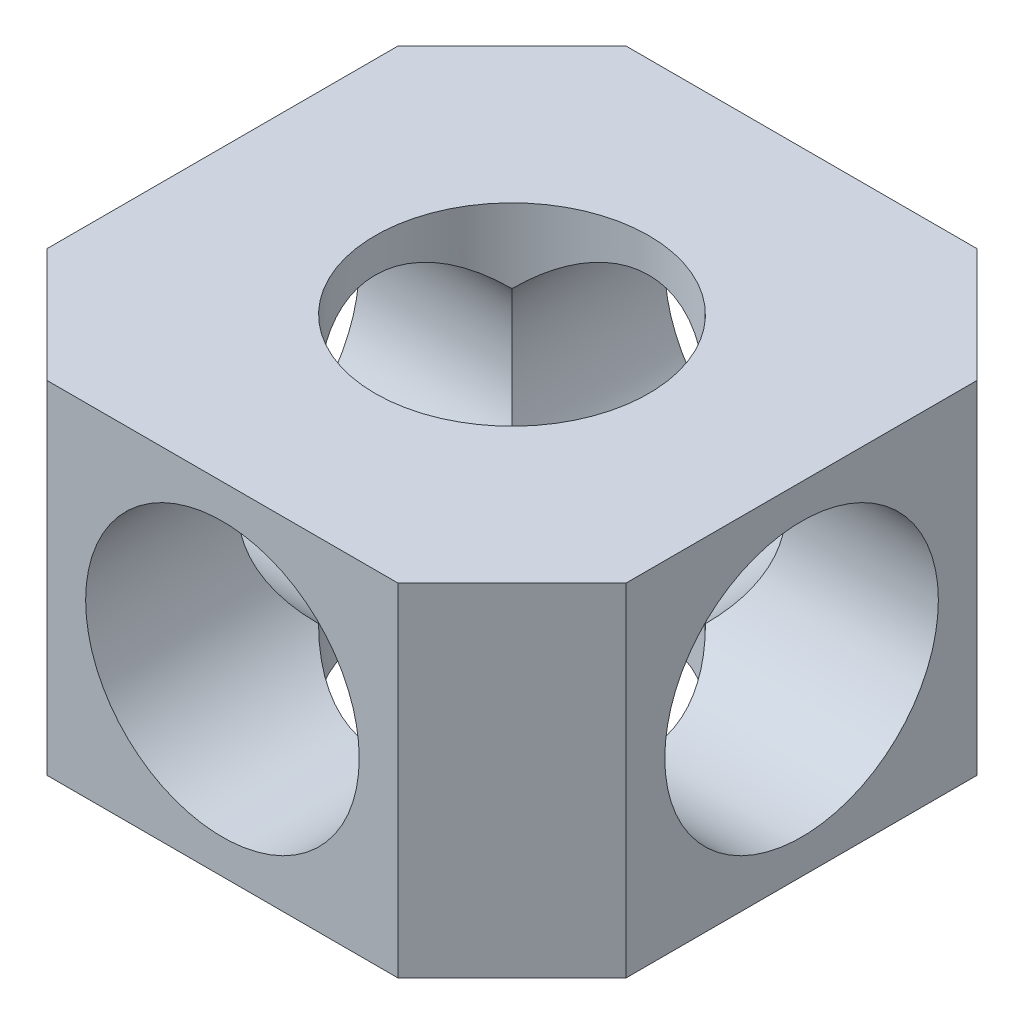
ISO-10303-21;
HEADER;
FILE_DESCRIPTION(('STEP AP214'),'2;1');
FILE_NAME('part.step','',(''),(''),'','','');
FILE_SCHEMA(('AUTOMOTIVE_DESIGN { 1 0 10303 214 1 1 1 1 }'));
ENDSEC;
DATA;
#1=APPLICATION_CONTEXT('core data for automotive mechanical design processes');
#2=APPLICATION_PROTOCOL_DEFINITION('international standard','automotive_design',2000,#1);
#3=PRODUCT_CONTEXT('',#1,'mechanical');
#4=PRODUCT('Part','Part','',(#3));
#5=PRODUCT_RELATED_PRODUCT_CATEGORY('part','',(#4));
#6=PRODUCT_DEFINITION_FORMATION('','',#4);
#7=PRODUCT_DEFINITION_CONTEXT('part definition',#1,'design');
#8=PRODUCT_DEFINITION('design','',#6,#7);
#9=PRODUCT_DEFINITION_SHAPE('','',#8);
#10=(LENGTH_UNIT() NAMED_UNIT(*) SI_UNIT(.MILLI.,.METRE.));
#11=(NAMED_UNIT(*) PLANE_ANGLE_UNIT() SI_UNIT($,.RADIAN.));
#12=(NAMED_UNIT(*) SI_UNIT($,.STERADIAN.) SOLID_ANGLE_UNIT());
#13=UNCERTAINTY_MEASURE_WITH_UNIT(LENGTH_MEASURE(1.E-05),#10,'distance_accuracy_value','');
#14=(GEOMETRIC_REPRESENTATION_CONTEXT(3) GLOBAL_UNCERTAINTY_ASSIGNED_CONTEXT((#13)) GLOBAL_UNIT_ASSIGNED_CONTEXT((#10,
#11,#12)) REPRESENTATION_CONTEXT('',''));
#15=CARTESIAN_POINT('',(0.,0.,0.));
#16=DIRECTION('',(0.,0.,1.));
#17=DIRECTION('',(1.,0.,0.));
#18=AXIS2_PLACEMENT_3D('',#15,#16,#17);
#19=CARTESIAN_POINT('',(0.,-7.5,0.));
#20=DIRECTION('',(0.,1.,0.));
#21=DIRECTION('',(0.,0.,1.));
#22=AXIS2_PLACEMENT_3D('',#19,#20,#21);
#23=CYLINDRICAL_SURFACE('',#22,6.);
#24=CARTESIAN_POINT('',(0.,7.5,0.));
#25=DIRECTION('',(0.,1.,0.));
#26=DIRECTION('',(0.,0.,1.));
#27=AXIS2_PLACEMENT_3D('',#24,#25,#26);
#28=CIRCLE('',#27,6.);
#29=CARTESIAN_POINT('',(0.,7.5,6.));
#30=VERTEX_POINT('',#29);
#31=EDGE_CURVE('E184',#30,#30,#28,.T.);
#32=ORIENTED_EDGE('',*,*,#31,.T.);
#33=EDGE_LOOP('',(#32));
#34=FACE_BOUND('',#33,.T.);
#35=CARTESIAN_POINT('',(0.,0.,0.));
#36=DIRECTION('',(-0.707106781186547,0.707106781186548,0.));
#37=DIRECTION('',(0.707106781186547,0.707106781186548,0.));
#38=AXIS2_PLACEMENT_3D('',#35,#36,#37);
#39=ELLIPSE('',#38,8.48528137423857,6.);
#40=CARTESIAN_POINT('',(4.24264068711929,4.24264068711929,-4.24264068711928));
#41=VERTEX_POINT('',#40);
#42=CARTESIAN_POINT('',(4.24264068711928,4.24264068711928,4.24264068711929));
#43=VERTEX_POINT('',#42);
#44=EDGE_CURVE('E139',#41,#43,#39,.F.);
#45=ORIENTED_EDGE('',*,*,#44,.T.);
#46=CARTESIAN_POINT('',(0.,0.,0.));
#47=DIRECTION('',(0.,0.707106781186547,-0.707106781186547));
#48=DIRECTION('',(0.,0.707106781186547,0.707106781186547));
#49=AXIS2_PLACEMENT_3D('',#46,#47,#48);
#50=ELLIPSE('',#49,8.48528137423857,6.);
#51=CARTESIAN_POINT('',(-4.24264068711929,4.24264068711929,4.24264068711928));
#52=VERTEX_POINT('',#51);
#53=EDGE_CURVE('E60',#43,#52,#50,.F.);
#54=ORIENTED_EDGE('',*,*,#53,.T.);
#55=CARTESIAN_POINT('',(0.,0.,0.));
#56=DIRECTION('',(0.707106781186547,0.707106781186548,0.));
#57=DIRECTION('',(-0.707106781186547,0.707106781186548,0.));
#58=AXIS2_PLACEMENT_3D('',#55,#56,#57);
#59=ELLIPSE('',#58,8.48528137423857,6.);
#60=CARTESIAN_POINT('',(-4.24264068711928,4.24264068711928,-4.24264068711929));
#61=VERTEX_POINT('',#60);
#62=EDGE_CURVE('E153',#52,#61,#59,.F.);
#63=ORIENTED_EDGE('',*,*,#62,.T.);
#64=CARTESIAN_POINT('',(0.,0.,0.));
#65=DIRECTION('',(0.,0.707106781186547,0.707106781186547));
#66=DIRECTION('',(0.,0.707106781186547,-0.707106781186547));
#67=AXIS2_PLACEMENT_3D('',#64,#65,#66);
#68=ELLIPSE('',#67,8.48528137423857,6.);
#69=EDGE_CURVE('E167',#61,#41,#68,.F.);
#70=ORIENTED_EDGE('',*,*,#69,.T.);
#71=EDGE_LOOP('',(#45,#54,#63,#70));
#72=FACE_BOUND('',#71,.T.);
#73=ADVANCED_FACE('F43',(#34,#72),#23,.F.);
#74=CARTESIAN_POINT('',(12.7,7.5,-12.7));
#75=DIRECTION('',(-1.,0.,0.));
#76=DIRECTION('',(0.,0.,1.));
#77=AXIS2_PLACEMENT_3D('',#74,#75,#76);
#78=PLANE('',#77);
#79=CARTESIAN_POINT('',(12.7,0.,0.));
#80=DIRECTION('',(-1.,0.,0.));
#81=DIRECTION('',(0.,0.,1.));
#82=AXIS2_PLACEMENT_3D('',#79,#80,#81);
#83=CIRCLE('',#82,6.);
#84=CARTESIAN_POINT('',(12.7,0.,6.));
#85=VERTEX_POINT('',#84);
#86=EDGE_CURVE('E180',#85,#85,#83,.T.);
#87=ORIENTED_EDGE('',*,*,#86,.T.);
#88=EDGE_LOOP('',(#87));
#89=FACE_BOUND('',#88,.T.);
#90=DIRECTION('',(0.,0.,-1.));
#91=VECTOR('',#90,1.);
#92=CARTESIAN_POINT('',(12.7,7.5,-12.7));
#93=LINE('',#92,#91);
#94=CARTESIAN_POINT('',(12.7,7.5,7.69999999999999));
#95=VERTEX_POINT('',#94);
#96=CARTESIAN_POINT('',(12.7,7.5,-7.69999999999998));
#97=VERTEX_POINT('',#96);
#98=EDGE_CURVE('E196',#95,#97,#93,.T.);
#99=ORIENTED_EDGE('',*,*,#98,.F.);
#100=DIRECTION('',(0.,-1.,0.));
#101=VECTOR('',#100,1.);
#102=CARTESIAN_POINT('',(12.7,7.5,7.69999999999999));
#103=LINE('',#102,#101);
#104=CARTESIAN_POINT('',(12.7,-7.5,7.69999999999999));
#105=VERTEX_POINT('',#104);
#106=EDGE_CURVE('E230',#95,#105,#103,.T.);
#107=ORIENTED_EDGE('',*,*,#106,.T.);
#108=DIRECTION('',(0.,0.,-1.));
#109=VECTOR('',#108,1.);
#110=CARTESIAN_POINT('',(12.7,-7.5,-12.7));
#111=LINE('',#110,#109);
#112=CARTESIAN_POINT('',(12.7,-7.5,-7.69999999999998));
#113=VERTEX_POINT('',#112);
#114=EDGE_CURVE('E192',#105,#113,#111,.T.);
#115=ORIENTED_EDGE('',*,*,#114,.T.);
#116=DIRECTION('',(0.,1.,0.));
#117=VECTOR('',#116,1.);
#118=CARTESIAN_POINT('',(12.7,7.5,-7.69999999999998));
#119=LINE('',#118,#117);
#120=EDGE_CURVE('E213',#113,#97,#119,.T.);
#121=ORIENTED_EDGE('',*,*,#120,.T.);
#122=EDGE_LOOP('',(#99,#107,#115,#121));
#123=FACE_BOUND('',#122,.T.);
#124=ADVANCED_FACE('F304',(#89,#123),#78,.F.);
#125=CARTESIAN_POINT('',(-12.7,7.5,-12.7));
#126=DIRECTION('',(0.,0.,1.));
#127=DIRECTION('',(1.,0.,0.));
#128=AXIS2_PLACEMENT_3D('',#125,#126,#127);
#129=PLANE('',#128);
#130=CARTESIAN_POINT('',(0.,0.,-12.7));
#131=DIRECTION('',(0.,0.,-1.));
#132=DIRECTION('',(-1.,0.,0.));
#133=AXIS2_PLACEMENT_3D('',#130,#131,#132);
#134=CIRCLE('',#133,6.);
#135=CARTESIAN_POINT('',(-5.99999999999996,0.,-12.7));
#136=VERTEX_POINT('',#135);
#137=EDGE_CURVE('E353',#136,#136,#134,.T.);
#138=ORIENTED_EDGE('',*,*,#137,.F.);
#139=EDGE_LOOP('',(#138));
#140=FACE_BOUND('',#139,.T.);
#141=DIRECTION('',(-1.,0.,0.));
#142=VECTOR('',#141,1.);
#143=CARTESIAN_POINT('',(-12.7,7.5,-12.7));
#144=LINE('',#143,#142);
#145=CARTESIAN_POINT('',(7.69999999999999,7.5,-12.7));
#146=VERTEX_POINT('',#145);
#147=CARTESIAN_POINT('',(-7.69999999999999,7.5,-12.7));
#148=VERTEX_POINT('',#147);
#149=EDGE_CURVE('E200',#146,#148,#144,.T.);
#150=ORIENTED_EDGE('',*,*,#149,.F.);
#151=DIRECTION('',(0.,-1.,0.));
#152=VECTOR('',#151,1.);
#153=CARTESIAN_POINT('',(7.69999999999999,7.5,-12.7));
#154=LINE('',#153,#152);
#155=CARTESIAN_POINT('',(7.69999999999999,-7.5,-12.7));
#156=VERTEX_POINT('',#155);
#157=EDGE_CURVE('E268',#146,#156,#154,.T.);
#158=ORIENTED_EDGE('',*,*,#157,.T.);
#159=DIRECTION('',(-1.,0.,0.));
#160=VECTOR('',#159,1.);
#161=CARTESIAN_POINT('',(-12.7,-7.5,-12.7));
#162=LINE('',#161,#160);
#163=CARTESIAN_POINT('',(-7.69999999999999,-7.5,-12.7));
#164=VERTEX_POINT('',#163);
#165=EDGE_CURVE('E217',#156,#164,#162,.T.);
#166=ORIENTED_EDGE('',*,*,#165,.T.);
#167=DIRECTION('',(0.,1.,0.));
#168=VECTOR('',#167,1.);
#169=CARTESIAN_POINT('',(-7.69999999999999,7.5,-12.7));
#170=LINE('',#169,#168);
#171=EDGE_CURVE('E265',#164,#148,#170,.T.);
#172=ORIENTED_EDGE('',*,*,#171,.T.);
#173=EDGE_LOOP('',(#150,#158,#166,#172));
#174=FACE_BOUND('',#173,.T.);
#175=ADVANCED_FACE('F312',(#140,#174),#129,.F.);
#176=CARTESIAN_POINT('',(-12.7,7.5,-12.7));
#177=DIRECTION('',(1.,0.,0.));
#178=DIRECTION('',(0.,0.,-1.));
#179=AXIS2_PLACEMENT_3D('',#176,#177,#178);
#180=PLANE('',#179);
#181=CARTESIAN_POINT('',(-12.7,0.,0.));
#182=DIRECTION('',(-1.,0.,0.));
#183=DIRECTION('',(0.,0.,1.));
#184=AXIS2_PLACEMENT_3D('',#181,#182,#183);
#185=CIRCLE('',#184,6.);
#186=CARTESIAN_POINT('',(-12.7,0.,6.));
#187=VERTEX_POINT('',#186);
#188=EDGE_CURVE('E174',#187,#187,#185,.T.);
#189=ORIENTED_EDGE('',*,*,#188,.F.);
#190=EDGE_LOOP('',(#189));
#191=FACE_BOUND('',#190,.T.);
#192=DIRECTION('',(0.,0.,1.));
#193=VECTOR('',#192,1.);
#194=CARTESIAN_POINT('',(-12.7,7.5,-12.7));
#195=LINE('',#194,#193);
#196=CARTESIAN_POINT('',(-12.7,7.5,-7.69999999999999));
#197=VERTEX_POINT('',#196);
#198=CARTESIAN_POINT('',(-12.7,7.5,7.69999999999999));
#199=VERTEX_POINT('',#198);
#200=EDGE_CURVE('E205',#197,#199,#195,.T.);
#201=ORIENTED_EDGE('',*,*,#200,.F.);
#202=DIRECTION('',(0.,-1.,0.));
#203=VECTOR('',#202,1.);
#204=CARTESIAN_POINT('',(-12.7,7.5,-7.69999999999999));
#205=LINE('',#204,#203);
#206=CARTESIAN_POINT('',(-12.7,-7.5,-7.69999999999999));
#207=VERTEX_POINT('',#206);
#208=EDGE_CURVE('E159',#197,#207,#205,.T.);
#209=ORIENTED_EDGE('',*,*,#208,.T.);
#210=DIRECTION('',(0.,0.,1.));
#211=VECTOR('',#210,1.);
#212=CARTESIAN_POINT('',(-12.7,-7.5,-12.7));
#213=LINE('',#212,#211);
#214=CARTESIAN_POINT('',(-12.7,-7.5,7.69999999999999));
#215=VERTEX_POINT('',#214);
#216=EDGE_CURVE('E221',#207,#215,#213,.T.);
#217=ORIENTED_EDGE('',*,*,#216,.T.);
#218=DIRECTION('',(0.,1.,0.));
#219=VECTOR('',#218,1.);
#220=CARTESIAN_POINT('',(-12.7,7.5,7.69999999999999));
#221=LINE('',#220,#219);
#222=EDGE_CURVE('E272',#215,#199,#221,.T.);
#223=ORIENTED_EDGE('',*,*,#222,.T.);
#224=EDGE_LOOP('',(#201,#209,#217,#223));
#225=FACE_BOUND('',#224,.T.);
#226=ADVANCED_FACE('F280',(#191,#225),#180,.F.);
#227=CARTESIAN_POINT('',(-12.7,7.5,12.7));
#228=DIRECTION('',(0.,0.,-1.));
#229=DIRECTION('',(-1.,0.,0.));
#230=AXIS2_PLACEMENT_3D('',#227,#228,#229);
#231=PLANE('',#230);
#232=CARTESIAN_POINT('',(0.,0.,12.7));
#233=DIRECTION('',(0.,0.,-1.));
#234=DIRECTION('',(-1.,0.,0.));
#235=AXIS2_PLACEMENT_3D('',#232,#233,#234);
#236=CIRCLE('',#235,6.);
#237=CARTESIAN_POINT('',(-6.00000000000004,0.,12.7));
#238=VERTEX_POINT('',#237);
#239=EDGE_CURVE('E149',#238,#238,#236,.T.);
#240=ORIENTED_EDGE('',*,*,#239,.T.);
#241=EDGE_LOOP('',(#240));
#242=FACE_BOUND('',#241,.T.);
#243=DIRECTION('',(1.,0.,0.));
#244=VECTOR('',#243,1.);
#245=CARTESIAN_POINT('',(-12.7,-7.5,12.7));
#246=LINE('',#245,#244);
#247=CARTESIAN_POINT('',(-7.69999999999999,-7.5,12.7));
#248=VERTEX_POINT('',#247);
#249=CARTESIAN_POINT('',(7.69999999999999,-7.5,12.7));
#250=VERTEX_POINT('',#249);
#251=EDGE_CURVE('E201',#248,#250,#246,.T.);
#252=ORIENTED_EDGE('',*,*,#251,.T.);
#253=DIRECTION('',(0.,1.,0.));
#254=VECTOR('',#253,1.);
#255=CARTESIAN_POINT('',(7.69999999999999,7.5,12.7));
#256=LINE('',#255,#254);
#257=CARTESIAN_POINT('',(7.69999999999999,7.5,12.7));
#258=VERTEX_POINT('',#257);
#259=EDGE_CURVE('E250',#250,#258,#256,.T.);
#260=ORIENTED_EDGE('',*,*,#259,.T.);
#261=DIRECTION('',(1.,0.,0.));
#262=VECTOR('',#261,1.);
#263=CARTESIAN_POINT('',(-12.7,7.5,12.7));
#264=LINE('',#263,#262);
#265=CARTESIAN_POINT('',(-7.69999999999999,7.5,12.7));
#266=VERTEX_POINT('',#265);
#267=EDGE_CURVE('E209',#266,#258,#264,.T.);
#268=ORIENTED_EDGE('',*,*,#267,.F.);
#269=DIRECTION('',(0.,-1.,0.));
#270=VECTOR('',#269,1.);
#271=CARTESIAN_POINT('',(-7.69999999999999,7.5,12.7));
#272=LINE('',#271,#270);
#273=EDGE_CURVE('E246',#266,#248,#272,.T.);
#274=ORIENTED_EDGE('',*,*,#273,.T.);
#275=EDGE_LOOP('',(#252,#260,#268,#274));
#276=FACE_BOUND('',#275,.T.);
#277=ADVANCED_FACE('F294',(#242,#276),#231,.F.);
#278=CARTESIAN_POINT('',(0.,7.5,0.));
#279=DIRECTION('',(0.,1.,0.));
#280=DIRECTION('',(0.,0.,1.));
#281=AXIS2_PLACEMENT_3D('',#278,#279,#280);
#282=PLANE('',#281);
#283=ORIENTED_EDGE('',*,*,#31,.F.);
#284=EDGE_LOOP('',(#283));
#285=FACE_BOUND('',#284,.T.);
#286=ORIENTED_EDGE('',*,*,#267,.T.);
#287=DIRECTION('',(-0.707106781186548,0.,0.707106781186547));
#288=VECTOR('',#287,1.);
#289=CARTESIAN_POINT('',(10.2,7.5,10.2));
#290=LINE('',#289,#288);
#291=EDGE_CURVE('E262',#258,#95,#290,.F.);
#292=ORIENTED_EDGE('',*,*,#291,.T.);
#293=ORIENTED_EDGE('',*,*,#98,.T.);
#294=DIRECTION('',(0.707106781186548,0.,0.707106781186548));
#295=VECTOR('',#294,1.);
#296=CARTESIAN_POINT('',(10.2,7.5,-10.2));
#297=LINE('',#296,#295);
#298=EDGE_CURVE('E259',#97,#146,#297,.F.);
#299=ORIENTED_EDGE('',*,*,#298,.T.);
#300=ORIENTED_EDGE('',*,*,#149,.T.);
#301=DIRECTION('',(0.707106781186548,0.,-0.707106781186547));
#302=VECTOR('',#301,1.);
#303=CARTESIAN_POINT('',(-10.2,7.5,-10.2));
#304=LINE('',#303,#302);
#305=EDGE_CURVE('E256',#148,#197,#304,.F.);
#306=ORIENTED_EDGE('',*,*,#305,.T.);
#307=ORIENTED_EDGE('',*,*,#200,.T.);
#308=DIRECTION('',(-0.707106781186548,0.,-0.707106781186547));
#309=VECTOR('',#308,1.);
#310=CARTESIAN_POINT('',(-10.2,7.5,10.2));
#311=LINE('',#310,#309);
#312=EDGE_CURVE('E253',#199,#266,#311,.F.);
#313=ORIENTED_EDGE('',*,*,#312,.T.);
#314=EDGE_LOOP('',(#286,#292,#293,#299,#300,#306,#307,#313));
#315=FACE_BOUND('',#314,.T.);
#316=ADVANCED_FACE('F298',(#285,#315),#282,.T.);
#317=CARTESIAN_POINT('',(0.,-7.5,0.));
#318=DIRECTION('',(0.,1.,0.));
#319=DIRECTION('',(0.,0.,1.));
#320=AXIS2_PLACEMENT_3D('',#317,#318,#319);
#321=PLANE('',#320);
#322=CARTESIAN_POINT('',(0.,-7.5,0.));
#323=DIRECTION('',(0.,1.,0.));
#324=DIRECTION('',(0.,0.,1.));
#325=AXIS2_PLACEMENT_3D('',#322,#323,#324);
#326=CIRCLE('',#325,6.);
#327=CARTESIAN_POINT('',(0.,-7.5,6.));
#328=VERTEX_POINT('',#327);
#329=EDGE_CURVE('E188',#328,#328,#326,.T.);
#330=ORIENTED_EDGE('',*,*,#329,.T.);
#331=EDGE_LOOP('',(#330));
#332=FACE_BOUND('',#331,.T.);
#333=ORIENTED_EDGE('',*,*,#114,.F.);
#334=DIRECTION('',(0.707106781186548,0.,-0.707106781186547));
#335=VECTOR('',#334,1.);
#336=CARTESIAN_POINT('',(12.7,-7.5,7.69999999999999));
#337=LINE('',#336,#335);
#338=EDGE_CURVE('E243',#105,#250,#337,.F.);
#339=ORIENTED_EDGE('',*,*,#338,.T.);
#340=ORIENTED_EDGE('',*,*,#251,.F.);
#341=DIRECTION('',(0.707106781186548,0.,0.707106781186547));
#342=VECTOR('',#341,1.);
#343=CARTESIAN_POINT('',(-7.69999999999999,-7.5,12.7));
#344=LINE('',#343,#342);
#345=EDGE_CURVE('E234',#248,#215,#344,.F.);
#346=ORIENTED_EDGE('',*,*,#345,.T.);
#347=ORIENTED_EDGE('',*,*,#216,.F.);
#348=DIRECTION('',(-0.707106781186548,0.,0.707106781186547));
#349=VECTOR('',#348,1.);
#350=CARTESIAN_POINT('',(-12.7,-7.5,-7.69999999999999));
#351=LINE('',#350,#349);
#352=EDGE_CURVE('E237',#207,#164,#351,.F.);
#353=ORIENTED_EDGE('',*,*,#352,.T.);
#354=ORIENTED_EDGE('',*,*,#165,.F.);
#355=DIRECTION('',(-0.707106781186548,0.,-0.707106781186548));
#356=VECTOR('',#355,1.);
#357=CARTESIAN_POINT('',(7.69999999999999,-7.5,-12.7));
#358=LINE('',#357,#356);
#359=EDGE_CURVE('E240',#156,#113,#358,.F.);
#360=ORIENTED_EDGE('',*,*,#359,.T.);
#361=EDGE_LOOP('',(#333,#339,#340,#346,#347,#353,#354,#360));
#362=FACE_BOUND('',#361,.T.);
#363=ADVANCED_FACE('F286',(#332,#362),#321,.F.);
#364=CARTESIAN_POINT('',(12.7,7.5,7.69999999999999));
#365=DIRECTION('',(-0.707106781186547,0.,-0.707106781186548));
#366=DIRECTION('',(0.,-1.,0.));
#367=AXIS2_PLACEMENT_3D('',#364,#365,#366);
#368=PLANE('',#367);
#369=ORIENTED_EDGE('',*,*,#291,.F.);
#370=ORIENTED_EDGE('',*,*,#259,.F.);
#371=ORIENTED_EDGE('',*,*,#338,.F.);
#372=ORIENTED_EDGE('',*,*,#106,.F.);
#373=EDGE_LOOP('',(#369,#370,#371,#372));
#374=FACE_BOUND('',#373,.T.);
#375=ADVANCED_FACE('F302',(#374),#368,.F.);
#376=CARTESIAN_POINT('',(7.69999999999999,7.5,-12.7));
#377=DIRECTION('',(-0.707106781186548,0.,0.707106781186548));
#378=DIRECTION('',(0.,-1.,0.));
#379=AXIS2_PLACEMENT_3D('',#376,#377,#378);
#380=PLANE('',#379);
#381=ORIENTED_EDGE('',*,*,#298,.F.);
#382=ORIENTED_EDGE('',*,*,#120,.F.);
#383=ORIENTED_EDGE('',*,*,#359,.F.);
#384=ORIENTED_EDGE('',*,*,#157,.F.);
#385=EDGE_LOOP('',(#381,#382,#383,#384));
#386=FACE_BOUND('',#385,.T.);
#387=ADVANCED_FACE('F309',(#386),#380,.F.);
#388=CARTESIAN_POINT('',(-12.7,7.5,-7.69999999999999));
#389=DIRECTION('',(0.707106781186547,0.,0.707106781186547));
#390=DIRECTION('',(0.,-1.,0.));
#391=AXIS2_PLACEMENT_3D('',#388,#389,#390);
#392=PLANE('',#391);
#393=ORIENTED_EDGE('',*,*,#305,.F.);
#394=ORIENTED_EDGE('',*,*,#171,.F.);
#395=ORIENTED_EDGE('',*,*,#352,.F.);
#396=ORIENTED_EDGE('',*,*,#208,.F.);
#397=EDGE_LOOP('',(#393,#394,#395,#396));
#398=FACE_BOUND('',#397,.T.);
#399=ADVANCED_FACE('F314',(#398),#392,.F.);
#400=CARTESIAN_POINT('',(-7.69999999999999,7.5,12.7));
#401=DIRECTION('',(0.707106781186547,0.,-0.707106781186548));
#402=DIRECTION('',(0.,-1.,0.));
#403=AXIS2_PLACEMENT_3D('',#400,#401,#402);
#404=PLANE('',#403);
#405=ORIENTED_EDGE('',*,*,#312,.F.);
#406=ORIENTED_EDGE('',*,*,#222,.F.);
#407=ORIENTED_EDGE('',*,*,#345,.F.);
#408=ORIENTED_EDGE('',*,*,#273,.F.);
#409=EDGE_LOOP('',(#405,#406,#407,#408));
#410=FACE_BOUND('',#409,.T.);
#411=ADVANCED_FACE('F46',(#410),#404,.F.);
#412=CARTESIAN_POINT('',(0.,0.,0.));
#413=DIRECTION('',(0.707106781186547,0.707106781186548,0.));
#414=DIRECTION('',(-0.707106781186547,0.707106781186548,0.));
#415=AXIS2_PLACEMENT_3D('',#412,#413,#414);
#416=ELLIPSE('',#415,8.48528137423857,6.);
#417=CARTESIAN_POINT('',(4.24264068711928,-4.24264068711928,4.24264068711929));
#418=VERTEX_POINT('',#417);
#419=CARTESIAN_POINT('',(4.24264068711929,-4.24264068711929,-4.24264068711928));
#420=VERTEX_POINT('',#419);
#421=EDGE_CURVE('E145',#418,#420,#416,.T.);
#422=ORIENTED_EDGE('',*,*,#421,.T.);
#423=CARTESIAN_POINT('',(0.,0.,0.));
#424=DIRECTION('',(0.,0.707106781186547,-0.707106781186547));
#425=DIRECTION('',(0.,0.707106781186547,0.707106781186547));
#426=AXIS2_PLACEMENT_3D('',#423,#424,#425);
#427=ELLIPSE('',#426,8.48528137423857,6.);
#428=CARTESIAN_POINT('',(-4.24264068711928,-4.24264068711928,-4.24264068711929));
#429=VERTEX_POINT('',#428);
#430=EDGE_CURVE('E68',#420,#429,#427,.T.);
#431=ORIENTED_EDGE('',*,*,#430,.T.);
#432=CARTESIAN_POINT('',(0.,0.,0.));
#433=DIRECTION('',(-0.707106781186547,0.707106781186548,0.));
#434=DIRECTION('',(0.707106781186547,0.707106781186548,0.));
#435=AXIS2_PLACEMENT_3D('',#432,#433,#434);
#436=ELLIPSE('',#435,8.48528137423857,6.);
#437=CARTESIAN_POINT('',(-4.24264068711929,-4.24264068711929,4.24264068711928));
#438=VERTEX_POINT('',#437);
#439=EDGE_CURVE('E147',#429,#438,#436,.T.);
#440=ORIENTED_EDGE('',*,*,#439,.T.);
#441=CARTESIAN_POINT('',(0.,0.,0.));
#442=DIRECTION('',(0.,0.707106781186547,0.707106781186547));
#443=DIRECTION('',(0.,0.707106781186547,-0.707106781186547));
#444=AXIS2_PLACEMENT_3D('',#441,#442,#443);
#445=ELLIPSE('',#444,8.48528137423857,6.);
#446=EDGE_CURVE('E132',#438,#418,#445,.T.);
#447=ORIENTED_EDGE('',*,*,#446,.T.);
#448=EDGE_LOOP('',(#422,#431,#440,#447));
#449=FACE_BOUND('',#448,.T.);
#450=ORIENTED_EDGE('',*,*,#329,.F.);
#451=EDGE_LOOP('',(#450));
#452=FACE_BOUND('',#451,.T.);
#453=ADVANCED_FACE('F143',(#449,#452),#23,.F.);
#454=CARTESIAN_POINT('',(12.7,0.,0.));
#455=DIRECTION('',(-1.,0.,0.));
#456=DIRECTION('',(0.,0.,1.));
#457=AXIS2_PLACEMENT_3D('',#454,#455,#456);
#458=CYLINDRICAL_SURFACE('',#457,6.);
#459=ORIENTED_EDGE('',*,*,#188,.T.);
#460=EDGE_LOOP('',(#459));
#461=FACE_BOUND('',#460,.T.);
#462=ORIENTED_EDGE('',*,*,#62,.F.);
#463=CARTESIAN_POINT('',(0.,0.,0.));
#464=DIRECTION('',(-0.707106781186546,0.,-0.707106781186549));
#465=DIRECTION('',(-0.707106781186549,0.,0.707106781186546));
#466=AXIS2_PLACEMENT_3D('',#463,#464,#465);
#467=ELLIPSE('',#466,8.48528137423859,6.);
#468=EDGE_CURVE('E176',#52,#438,#467,.F.);
#469=ORIENTED_EDGE('',*,*,#468,.T.);
#470=ORIENTED_EDGE('',*,*,#439,.F.);
#471=CARTESIAN_POINT('',(0.,0.,0.));
#472=DIRECTION('',(-0.707106781186549,0.,0.707106781186546));
#473=DIRECTION('',(-0.707106781186546,0.,-0.707106781186549));
#474=AXIS2_PLACEMENT_3D('',#471,#472,#473);
#475=ELLIPSE('',#474,8.48528137423856,6.);
#476=EDGE_CURVE('E170',#429,#61,#475,.F.);
#477=ORIENTED_EDGE('',*,*,#476,.T.);
#478=EDGE_LOOP('',(#462,#469,#470,#477));
#479=FACE_BOUND('',#478,.T.);
#480=ADVANCED_FACE('F333',(#461,#479),#458,.F.);
#481=ORIENTED_EDGE('',*,*,#86,.F.);
#482=EDGE_LOOP('',(#481));
#483=FACE_BOUND('',#482,.T.);
#484=ORIENTED_EDGE('',*,*,#44,.F.);
#485=CARTESIAN_POINT('',(0.,0.,0.));
#486=DIRECTION('',(-0.707106781186546,0.,-0.707106781186549));
#487=DIRECTION('',(-0.707106781186549,0.,0.707106781186546));
#488=AXIS2_PLACEMENT_3D('',#485,#486,#487);
#489=ELLIPSE('',#488,8.48528137423859,6.);
#490=EDGE_CURVE('E11',#41,#420,#489,.T.);
#491=ORIENTED_EDGE('',*,*,#490,.T.);
#492=ORIENTED_EDGE('',*,*,#421,.F.);
#493=CARTESIAN_POINT('',(0.,0.,0.));
#494=DIRECTION('',(-0.707106781186549,0.,0.707106781186546));
#495=DIRECTION('',(-0.707106781186546,0.,-0.707106781186549));
#496=AXIS2_PLACEMENT_3D('',#493,#494,#495);
#497=ELLIPSE('',#496,8.48528137423856,6.);
#498=EDGE_CURVE('E53',#418,#43,#497,.T.);
#499=ORIENTED_EDGE('',*,*,#498,.T.);
#500=EDGE_LOOP('',(#484,#491,#492,#499));
#501=FACE_BOUND('',#500,.T.);
#502=ADVANCED_FACE('F151',(#483,#501),#458,.F.);
#503=CARTESIAN_POINT('',(0.,0.,12.7));
#504=DIRECTION('',(0.,0.,-1.));
#505=DIRECTION('',(-1.,0.,0.));
#506=AXIS2_PLACEMENT_3D('',#503,#504,#505);
#507=CYLINDRICAL_SURFACE('',#506,6.);
#508=ORIENTED_EDGE('',*,*,#239,.F.);
#509=EDGE_LOOP('',(#508));
#510=FACE_BOUND('',#509,.T.);
#511=ORIENTED_EDGE('',*,*,#53,.F.);
#512=ORIENTED_EDGE('',*,*,#498,.F.);
#513=ORIENTED_EDGE('',*,*,#446,.F.);
#514=ORIENTED_EDGE('',*,*,#468,.F.);
#515=EDGE_LOOP('',(#511,#512,#513,#514));
#516=FACE_BOUND('',#515,.T.);
#517=ADVANCED_FACE('F131',(#510,#516),#507,.F.);
#518=ORIENTED_EDGE('',*,*,#137,.T.);
#519=EDGE_LOOP('',(#518));
#520=FACE_BOUND('',#519,.T.);
#521=ORIENTED_EDGE('',*,*,#430,.F.);
#522=ORIENTED_EDGE('',*,*,#490,.F.);
#523=ORIENTED_EDGE('',*,*,#69,.F.);
#524=ORIENTED_EDGE('',*,*,#476,.F.);
#525=EDGE_LOOP('',(#521,#522,#523,#524));
#526=FACE_BOUND('',#525,.T.);
#527=ADVANCED_FACE('F344',(#520,#526),#507,.F.);
#528=CLOSED_SHELL('',(#73,#124,#175,#226,#277,#316,#363,#375,#387,#399,#411,#453,#480,#502,#517,#527));
#529=MANIFOLD_SOLID_BREP('B2',#528);
#530=ADVANCED_BREP_SHAPE_REPRESENTATION('',(#18,#529),#14);
#531=SHAPE_DEFINITION_REPRESENTATION(#9,#530);
ENDSEC;
END-ISO-10303-21;
